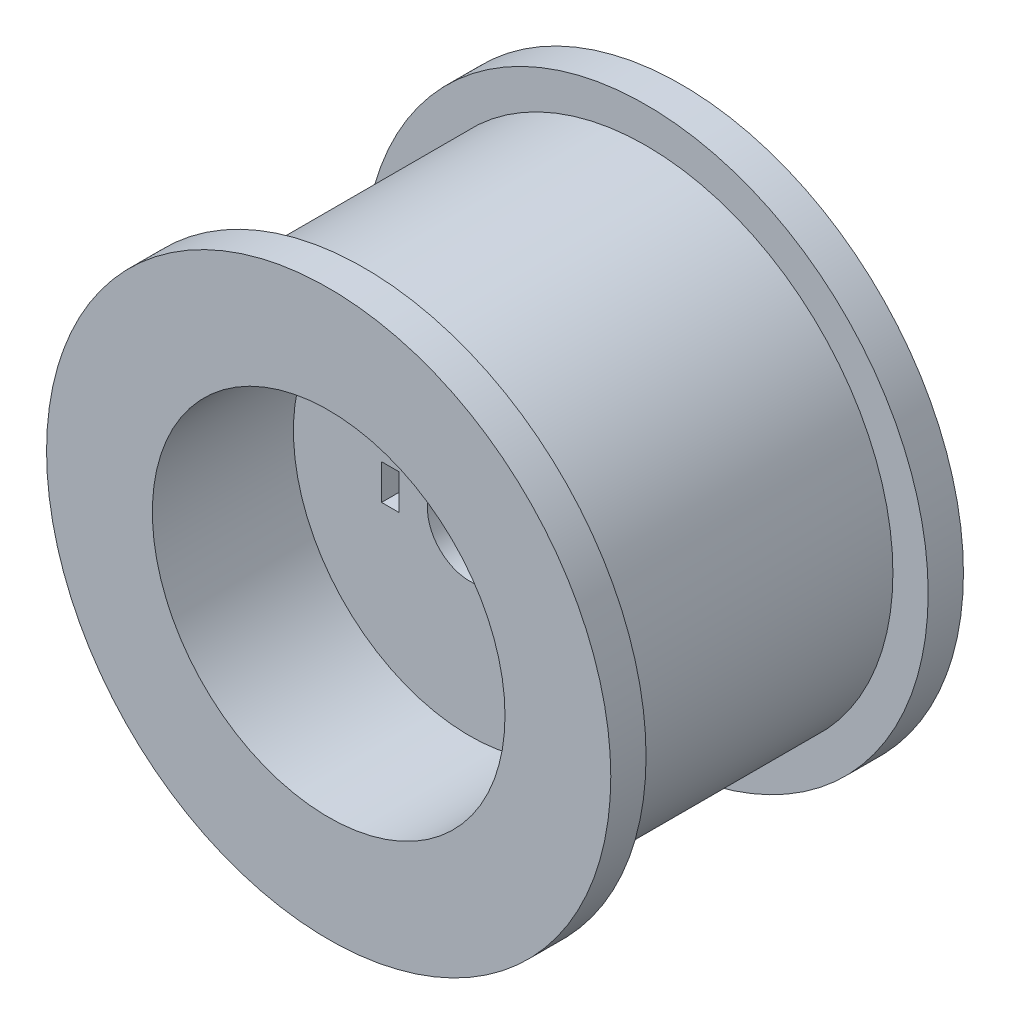
ISO-10303-21;
HEADER;
FILE_DESCRIPTION(('STEP AP214'),'2;1');
FILE_NAME('part.step','',(''),(''),'','','');
FILE_SCHEMA(('AUTOMOTIVE_DESIGN { 1 0 10303 214 1 1 1 1 }'));
ENDSEC;
DATA;
#1=APPLICATION_CONTEXT('core data for automotive mechanical design processes');
#2=APPLICATION_PROTOCOL_DEFINITION('international standard','automotive_design',2000,#1);
#3=PRODUCT_CONTEXT('',#1,'mechanical');
#4=PRODUCT('Part','Part','',(#3));
#5=PRODUCT_RELATED_PRODUCT_CATEGORY('part','',(#4));
#6=PRODUCT_DEFINITION_FORMATION('','',#4);
#7=PRODUCT_DEFINITION_CONTEXT('part definition',#1,'design');
#8=PRODUCT_DEFINITION('design','',#6,#7);
#9=PRODUCT_DEFINITION_SHAPE('','',#8);
#10=(LENGTH_UNIT() NAMED_UNIT(*) SI_UNIT(.MILLI.,.METRE.));
#11=(NAMED_UNIT(*) PLANE_ANGLE_UNIT() SI_UNIT($,.RADIAN.));
#12=(NAMED_UNIT(*) SI_UNIT($,.STERADIAN.) SOLID_ANGLE_UNIT());
#13=UNCERTAINTY_MEASURE_WITH_UNIT(LENGTH_MEASURE(1.E-05),#10,'distance_accuracy_value','');
#14=(GEOMETRIC_REPRESENTATION_CONTEXT(3) GLOBAL_UNCERTAINTY_ASSIGNED_CONTEXT((#13)) GLOBAL_UNIT_ASSIGNED_CONTEXT((#10,
#11,#12)) REPRESENTATION_CONTEXT('',''));
#15=CARTESIAN_POINT('',(0.,0.,0.));
#16=DIRECTION('',(0.,0.,1.));
#17=DIRECTION('',(1.,0.,0.));
#18=AXIS2_PLACEMENT_3D('',#15,#16,#17);
#19=CARTESIAN_POINT('',(0.,0.,40.));
#20=DIRECTION('',(0.,0.,-1.));
#21=DIRECTION('',(-1.,0.,0.));
#22=AXIS2_PLACEMENT_3D('',#19,#20,#21);
#23=CYLINDRICAL_SURFACE('',#22,35.);
#24=CARTESIAN_POINT('',(0.,0.,40.));
#25=DIRECTION('',(0.,0.,1.));
#26=DIRECTION('',(1.,0.,0.));
#27=AXIS2_PLACEMENT_3D('',#24,#25,#26);
#28=CIRCLE('',#27,35.);
#29=CARTESIAN_POINT('',(35.,0.,40.));
#30=VERTEX_POINT('',#29);
#31=EDGE_CURVE('E11',#30,#30,#28,.T.);
#32=ORIENTED_EDGE('',*,*,#31,.F.);
#33=EDGE_LOOP('',(#32));
#34=FACE_BOUND('',#33,.T.);
#35=CARTESIAN_POINT('',(0.,0.,0.));
#36=DIRECTION('',(0.,0.,1.));
#37=DIRECTION('',(1.,0.,0.));
#38=AXIS2_PLACEMENT_3D('',#35,#36,#37);
#39=CIRCLE('',#38,35.);
#40=CARTESIAN_POINT('',(35.,0.,0.));
#41=VERTEX_POINT('',#40);
#42=EDGE_CURVE('E129',#41,#41,#39,.T.);
#43=ORIENTED_EDGE('',*,*,#42,.T.);
#44=EDGE_LOOP('',(#43));
#45=FACE_BOUND('',#44,.T.);
#46=ADVANCED_FACE('F32',(#34,#45),#23,.T.);
#47=CARTESIAN_POINT('',(0.,0.,45.));
#48=DIRECTION('',(0.,0.,-1.));
#49=DIRECTION('',(-1.,0.,0.));
#50=AXIS2_PLACEMENT_3D('',#47,#48,#49);
#51=CYLINDRICAL_SURFACE('',#50,40.);
#52=CARTESIAN_POINT('',(0.,0.,45.));
#53=DIRECTION('',(0.,0.,1.));
#54=DIRECTION('',(1.,0.,0.));
#55=AXIS2_PLACEMENT_3D('',#52,#53,#54);
#56=CIRCLE('',#55,40.);
#57=CARTESIAN_POINT('',(40.,0.,45.));
#58=VERTEX_POINT('',#57);
#59=EDGE_CURVE('E40',#58,#58,#56,.T.);
#60=ORIENTED_EDGE('',*,*,#59,.F.);
#61=EDGE_LOOP('',(#60));
#62=FACE_BOUND('',#61,.T.);
#63=CARTESIAN_POINT('',(0.,0.,40.));
#64=DIRECTION('',(0.,0.,1.));
#65=DIRECTION('',(1.,0.,0.));
#66=AXIS2_PLACEMENT_3D('',#63,#64,#65);
#67=CIRCLE('',#66,40.);
#68=CARTESIAN_POINT('',(40.,0.,40.));
#69=VERTEX_POINT('',#68);
#70=EDGE_CURVE('E134',#69,#69,#67,.T.);
#71=ORIENTED_EDGE('',*,*,#70,.T.);
#72=EDGE_LOOP('',(#71));
#73=FACE_BOUND('',#72,.T.);
#74=ADVANCED_FACE('F165',(#62,#73),#51,.T.);
#75=CARTESIAN_POINT('',(0.,0.,45.));
#76=DIRECTION('',(0.,0.,1.));
#77=DIRECTION('',(1.,0.,0.));
#78=AXIS2_PLACEMENT_3D('',#75,#76,#77);
#79=PLANE('',#78);
#80=CARTESIAN_POINT('',(0.,0.,45.));
#81=DIRECTION('',(0.,0.,1.));
#82=DIRECTION('',(1.,0.,0.));
#83=AXIS2_PLACEMENT_3D('',#80,#81,#82);
#84=CIRCLE('',#83,25.);
#85=CARTESIAN_POINT('',(25.,0.,45.));
#86=VERTEX_POINT('',#85);
#87=EDGE_CURVE('E116',#86,#86,#84,.T.);
#88=ORIENTED_EDGE('',*,*,#87,.F.);
#89=EDGE_LOOP('',(#88));
#90=FACE_BOUND('',#89,.T.);
#91=ORIENTED_EDGE('',*,*,#59,.T.);
#92=EDGE_LOOP('',(#91));
#93=FACE_BOUND('',#92,.T.);
#94=ADVANCED_FACE('F159',(#90,#93),#79,.T.);
#95=CARTESIAN_POINT('',(0.,0.,40.));
#96=DIRECTION('',(0.,0.,1.));
#97=DIRECTION('',(1.,0.,0.));
#98=AXIS2_PLACEMENT_3D('',#95,#96,#97);
#99=PLANE('',#98);
#100=ORIENTED_EDGE('',*,*,#31,.T.);
#101=EDGE_LOOP('',(#100));
#102=FACE_BOUND('',#101,.T.);
#103=ORIENTED_EDGE('',*,*,#70,.F.);
#104=EDGE_LOOP('',(#103));
#105=FACE_BOUND('',#104,.T.);
#106=ADVANCED_FACE('F150',(#102,#105),#99,.F.);
#107=CARTESIAN_POINT('',(0.,0.,-5.));
#108=DIRECTION('',(0.,0.,1.));
#109=DIRECTION('',(1.,0.,0.));
#110=AXIS2_PLACEMENT_3D('',#107,#108,#109);
#111=CYLINDRICAL_SURFACE('',#110,40.);
#112=CARTESIAN_POINT('',(0.,0.,-5.));
#113=DIRECTION('',(0.,0.,-1.));
#114=DIRECTION('',(-1.,0.,0.));
#115=AXIS2_PLACEMENT_3D('',#112,#113,#114);
#116=CIRCLE('',#115,40.);
#117=CARTESIAN_POINT('',(-40.,0.,-5.));
#118=VERTEX_POINT('',#117);
#119=EDGE_CURVE('E126',#118,#118,#116,.T.);
#120=ORIENTED_EDGE('',*,*,#119,.F.);
#121=EDGE_LOOP('',(#120));
#122=FACE_BOUND('',#121,.T.);
#123=CARTESIAN_POINT('',(0.,0.,0.));
#124=DIRECTION('',(0.,0.,-1.));
#125=DIRECTION('',(-1.,0.,0.));
#126=AXIS2_PLACEMENT_3D('',#123,#124,#125);
#127=CIRCLE('',#126,40.);
#128=CARTESIAN_POINT('',(-40.,0.,0.));
#129=VERTEX_POINT('',#128);
#130=EDGE_CURVE('E123',#129,#129,#127,.T.);
#131=ORIENTED_EDGE('',*,*,#130,.T.);
#132=EDGE_LOOP('',(#131));
#133=FACE_BOUND('',#132,.T.);
#134=ADVANCED_FACE('F148',(#122,#133),#111,.T.);
#135=CARTESIAN_POINT('',(0.,0.,-5.));
#136=DIRECTION('',(0.,0.,-1.));
#137=DIRECTION('',(-1.,0.,0.));
#138=AXIS2_PLACEMENT_3D('',#135,#136,#137);
#139=PLANE('',#138);
#140=CARTESIAN_POINT('',(0.,0.,-5.));
#141=DIRECTION('',(0.,0.,-1.));
#142=DIRECTION('',(-1.,0.,0.));
#143=AXIS2_PLACEMENT_3D('',#140,#141,#142);
#144=CIRCLE('',#143,25.);
#145=CARTESIAN_POINT('',(-25.,0.,-5.));
#146=VERTEX_POINT('',#145);
#147=EDGE_CURVE('E117',#146,#146,#144,.T.);
#148=ORIENTED_EDGE('',*,*,#147,.F.);
#149=EDGE_LOOP('',(#148));
#150=FACE_BOUND('',#149,.T.);
#151=ORIENTED_EDGE('',*,*,#119,.T.);
#152=EDGE_LOOP('',(#151));
#153=FACE_BOUND('',#152,.T.);
#154=ADVANCED_FACE('F144',(#150,#153),#139,.T.);
#155=CARTESIAN_POINT('',(0.,0.,0.));
#156=DIRECTION('',(0.,0.,-1.));
#157=DIRECTION('',(-1.,0.,0.));
#158=AXIS2_PLACEMENT_3D('',#155,#156,#157);
#159=PLANE('',#158);
#160=ORIENTED_EDGE('',*,*,#42,.F.);
#161=EDGE_LOOP('',(#160));
#162=FACE_BOUND('',#161,.T.);
#163=ORIENTED_EDGE('',*,*,#130,.F.);
#164=EDGE_LOOP('',(#163));
#165=FACE_BOUND('',#164,.T.);
#166=ADVANCED_FACE('F140',(#162,#165),#159,.F.);
#167=CARTESIAN_POINT('',(0.,0.,25.));
#168=DIRECTION('',(0.,0.,1.));
#169=DIRECTION('',(1.,0.,0.));
#170=AXIS2_PLACEMENT_3D('',#167,#168,#169);
#171=CYLINDRICAL_SURFACE('',#170,25.);
#172=CARTESIAN_POINT('',(0.,0.,25.));
#173=DIRECTION('',(0.,0.,1.));
#174=DIRECTION('',(1.,0.,0.));
#175=AXIS2_PLACEMENT_3D('',#172,#173,#174);
#176=CIRCLE('',#175,25.);
#177=CARTESIAN_POINT('',(25.,0.,25.));
#178=VERTEX_POINT('',#177);
#179=EDGE_CURVE('E120',#178,#178,#176,.T.);
#180=ORIENTED_EDGE('',*,*,#179,.F.);
#181=EDGE_LOOP('',(#180));
#182=FACE_BOUND('',#181,.T.);
#183=ORIENTED_EDGE('',*,*,#87,.T.);
#184=EDGE_LOOP('',(#183));
#185=FACE_BOUND('',#184,.T.);
#186=ADVANCED_FACE('F143',(#182,#185),#171,.F.);
#187=CARTESIAN_POINT('',(0.,0.,25.));
#188=DIRECTION('',(0.,0.,1.));
#189=DIRECTION('',(1.,0.,0.));
#190=AXIS2_PLACEMENT_3D('',#187,#188,#189);
#191=PLANE('',#190);
#192=DIRECTION('',(0.,1.,0.));
#193=VECTOR('',#192,1.);
#194=CARTESIAN_POINT('',(-10.,-0.0730995796232149,25.));
#195=LINE('',#194,#193);
#196=CARTESIAN_POINT('',(-10.,-2.57309957962322,25.));
#197=VERTEX_POINT('',#196);
#198=CARTESIAN_POINT('',(-10.,2.42690042037679,25.));
#199=VERTEX_POINT('',#198);
#200=EDGE_CURVE('E78',#197,#199,#195,.T.);
#201=ORIENTED_EDGE('',*,*,#200,.F.);
#202=DIRECTION('',(1.,0.,0.));
#203=VECTOR('',#202,1.);
#204=CARTESIAN_POINT('',(-10.,-2.57309957962322,25.));
#205=LINE('',#204,#203);
#206=CARTESIAN_POINT('',(-12.5,-2.57309957962322,25.));
#207=VERTEX_POINT('',#206);
#208=EDGE_CURVE('E93',#207,#197,#205,.T.);
#209=ORIENTED_EDGE('',*,*,#208,.F.);
#210=DIRECTION('',(0.,-1.,0.));
#211=VECTOR('',#210,1.);
#212=CARTESIAN_POINT('',(-12.5,-0.0730995796232143,25.));
#213=LINE('',#212,#211);
#214=CARTESIAN_POINT('',(-12.5,2.42690042037679,25.));
#215=VERTEX_POINT('',#214);
#216=EDGE_CURVE('E100',#215,#207,#213,.T.);
#217=ORIENTED_EDGE('',*,*,#216,.F.);
#218=DIRECTION('',(-1.,0.,0.));
#219=VECTOR('',#218,1.);
#220=CARTESIAN_POINT('',(-10.,2.42690042037679,25.));
#221=LINE('',#220,#219);
#222=EDGE_CURVE('E98',#199,#215,#221,.T.);
#223=ORIENTED_EDGE('',*,*,#222,.F.);
#224=EDGE_LOOP('',(#201,#209,#217,#223));
#225=FACE_BOUND('',#224,.T.);
#226=CARTESIAN_POINT('',(0.,0.,25.));
#227=DIRECTION('',(0.,0.,1.));
#228=DIRECTION('',(1.,0.,0.));
#229=AXIS2_PLACEMENT_3D('',#226,#227,#228);
#230=CIRCLE('',#229,6.);
#231=CARTESIAN_POINT('',(6.,0.,25.));
#232=VERTEX_POINT('',#231);
#233=EDGE_CURVE('E107',#232,#232,#230,.T.);
#234=ORIENTED_EDGE('',*,*,#233,.F.);
#235=EDGE_LOOP('',(#234));
#236=FACE_BOUND('',#235,.T.);
#237=ORIENTED_EDGE('',*,*,#179,.T.);
#238=EDGE_LOOP('',(#237));
#239=FACE_BOUND('',#238,.T.);
#240=ADVANCED_FACE('F186',(#225,#236,#239),#191,.T.);
#241=CARTESIAN_POINT('',(0.,0.,15.));
#242=DIRECTION('',(0.,0.,-1.));
#243=DIRECTION('',(-1.,0.,0.));
#244=AXIS2_PLACEMENT_3D('',#241,#242,#243);
#245=CYLINDRICAL_SURFACE('',#244,25.);
#246=CARTESIAN_POINT('',(0.,0.,15.));
#247=DIRECTION('',(0.,0.,-1.));
#248=DIRECTION('',(-1.,0.,0.));
#249=AXIS2_PLACEMENT_3D('',#246,#247,#248);
#250=CIRCLE('',#249,25.);
#251=CARTESIAN_POINT('',(-25.,0.,15.));
#252=VERTEX_POINT('',#251);
#253=EDGE_CURVE('E113',#252,#252,#250,.T.);
#254=ORIENTED_EDGE('',*,*,#253,.F.);
#255=EDGE_LOOP('',(#254));
#256=FACE_BOUND('',#255,.T.);
#257=ORIENTED_EDGE('',*,*,#147,.T.);
#258=EDGE_LOOP('',(#257));
#259=FACE_BOUND('',#258,.T.);
#260=ADVANCED_FACE('F192',(#256,#259),#245,.F.);
#261=CARTESIAN_POINT('',(0.,0.,15.));
#262=DIRECTION('',(0.,0.,-1.));
#263=DIRECTION('',(-1.,0.,0.));
#264=AXIS2_PLACEMENT_3D('',#261,#262,#263);
#265=PLANE('',#264);
#266=DIRECTION('',(0.,1.,0.));
#267=VECTOR('',#266,1.);
#268=CARTESIAN_POINT('',(-10.,-0.0730995796232149,15.));
#269=LINE('',#268,#267);
#270=CARTESIAN_POINT('',(-10.,-2.57309957962322,15.));
#271=VERTEX_POINT('',#270);
#272=CARTESIAN_POINT('',(-10.,2.42690042037679,15.));
#273=VERTEX_POINT('',#272);
#274=EDGE_CURVE('E75',#271,#273,#269,.T.);
#275=ORIENTED_EDGE('',*,*,#274,.T.);
#276=DIRECTION('',(-1.,0.,0.));
#277=VECTOR('',#276,1.);
#278=CARTESIAN_POINT('',(-10.,2.42690042037679,15.));
#279=LINE('',#278,#277);
#280=CARTESIAN_POINT('',(-12.5,2.42690042037679,15.));
#281=VERTEX_POINT('',#280);
#282=EDGE_CURVE('E84',#273,#281,#279,.T.);
#283=ORIENTED_EDGE('',*,*,#282,.T.);
#284=DIRECTION('',(0.,-1.,0.));
#285=VECTOR('',#284,1.);
#286=CARTESIAN_POINT('',(-12.5,-0.0730995796232143,15.));
#287=LINE('',#286,#285);
#288=CARTESIAN_POINT('',(-12.5,-2.57309957962322,15.));
#289=VERTEX_POINT('',#288);
#290=EDGE_CURVE('E56',#281,#289,#287,.T.);
#291=ORIENTED_EDGE('',*,*,#290,.T.);
#292=DIRECTION('',(1.,0.,0.));
#293=VECTOR('',#292,1.);
#294=CARTESIAN_POINT('',(-10.,-2.57309957962322,15.));
#295=LINE('',#294,#293);
#296=EDGE_CURVE('E81',#289,#271,#295,.T.);
#297=ORIENTED_EDGE('',*,*,#296,.T.);
#298=EDGE_LOOP('',(#275,#283,#291,#297));
#299=FACE_BOUND('',#298,.T.);
#300=CARTESIAN_POINT('',(0.,0.,15.));
#301=DIRECTION('',(0.,0.,-1.));
#302=DIRECTION('',(-1.,0.,0.));
#303=AXIS2_PLACEMENT_3D('',#300,#301,#302);
#304=CIRCLE('',#303,6.);
#305=CARTESIAN_POINT('',(-6.,0.,15.));
#306=VERTEX_POINT('',#305);
#307=EDGE_CURVE('E35',#306,#306,#304,.T.);
#308=ORIENTED_EDGE('',*,*,#307,.F.);
#309=EDGE_LOOP('',(#308));
#310=FACE_BOUND('',#309,.T.);
#311=ORIENTED_EDGE('',*,*,#253,.T.);
#312=EDGE_LOOP('',(#311));
#313=FACE_BOUND('',#312,.T.);
#314=ADVANCED_FACE('F89',(#299,#310,#313),#265,.T.);
#315=CARTESIAN_POINT('',(0.,0.,5.));
#316=DIRECTION('',(0.,0.,1.));
#317=DIRECTION('',(1.,0.,0.));
#318=AXIS2_PLACEMENT_3D('',#315,#316,#317);
#319=CYLINDRICAL_SURFACE('',#318,6.);
#320=ORIENTED_EDGE('',*,*,#307,.T.);
#321=EDGE_LOOP('',(#320));
#322=FACE_BOUND('',#321,.T.);
#323=ORIENTED_EDGE('',*,*,#233,.T.);
#324=EDGE_LOOP('',(#323));
#325=FACE_BOUND('',#324,.T.);
#326=ADVANCED_FACE('F202',(#322,#325),#319,.F.);
#327=CARTESIAN_POINT('',(-10.,-0.0730995796232149,15.));
#328=DIRECTION('',(1.,0.,0.));
#329=DIRECTION('',(0.,0.,-1.));
#330=AXIS2_PLACEMENT_3D('',#327,#328,#329);
#331=PLANE('',#330);
#332=ORIENTED_EDGE('',*,*,#200,.T.);
#333=DIRECTION('',(0.,0.,1.));
#334=VECTOR('',#333,1.);
#335=CARTESIAN_POINT('',(-10.,2.42690042037679,15.));
#336=LINE('',#335,#334);
#337=EDGE_CURVE('E48',#273,#199,#336,.T.);
#338=ORIENTED_EDGE('',*,*,#337,.F.);
#339=ORIENTED_EDGE('',*,*,#274,.F.);
#340=DIRECTION('',(0.,0.,1.));
#341=VECTOR('',#340,1.);
#342=CARTESIAN_POINT('',(-10.,-2.57309957962322,15.));
#343=LINE('',#342,#341);
#344=EDGE_CURVE('E105',#271,#197,#343,.T.);
#345=ORIENTED_EDGE('',*,*,#344,.T.);
#346=EDGE_LOOP('',(#332,#338,#339,#345));
#347=FACE_BOUND('',#346,.T.);
#348=ADVANCED_FACE('F73',(#347),#331,.F.);
#349=CARTESIAN_POINT('',(-10.,-2.57309957962322,15.));
#350=DIRECTION('',(0.,-1.,0.));
#351=DIRECTION('',(1.,0.,0.));
#352=AXIS2_PLACEMENT_3D('',#349,#350,#351);
#353=PLANE('',#352);
#354=ORIENTED_EDGE('',*,*,#208,.T.);
#355=ORIENTED_EDGE('',*,*,#344,.F.);
#356=ORIENTED_EDGE('',*,*,#296,.F.);
#357=DIRECTION('',(0.,0.,1.));
#358=VECTOR('',#357,1.);
#359=CARTESIAN_POINT('',(-12.5,-2.57309957962322,15.));
#360=LINE('',#359,#358);
#361=EDGE_CURVE('E108',#289,#207,#360,.T.);
#362=ORIENTED_EDGE('',*,*,#361,.T.);
#363=EDGE_LOOP('',(#354,#355,#356,#362));
#364=FACE_BOUND('',#363,.T.);
#365=ADVANCED_FACE('F211',(#364),#353,.F.);
#366=CARTESIAN_POINT('',(-12.5,-0.0730995796232143,15.));
#367=DIRECTION('',(-1.,0.,0.));
#368=DIRECTION('',(0.,0.,1.));
#369=AXIS2_PLACEMENT_3D('',#366,#367,#368);
#370=PLANE('',#369);
#371=ORIENTED_EDGE('',*,*,#216,.T.);
#372=ORIENTED_EDGE('',*,*,#361,.F.);
#373=ORIENTED_EDGE('',*,*,#290,.F.);
#374=DIRECTION('',(0.,0.,1.));
#375=VECTOR('',#374,1.);
#376=CARTESIAN_POINT('',(-12.5,2.42690042037679,15.));
#377=LINE('',#376,#375);
#378=EDGE_CURVE('E80',#281,#215,#377,.T.);
#379=ORIENTED_EDGE('',*,*,#378,.T.);
#380=EDGE_LOOP('',(#371,#372,#373,#379));
#381=FACE_BOUND('',#380,.T.);
#382=ADVANCED_FACE('F208',(#381),#370,.F.);
#383=CARTESIAN_POINT('',(-10.,2.42690042037679,15.));
#384=DIRECTION('',(0.,1.,0.));
#385=DIRECTION('',(0.,0.,1.));
#386=AXIS2_PLACEMENT_3D('',#383,#384,#385);
#387=PLANE('',#386);
#388=ORIENTED_EDGE('',*,*,#222,.T.);
#389=ORIENTED_EDGE('',*,*,#378,.F.);
#390=ORIENTED_EDGE('',*,*,#282,.F.);
#391=ORIENTED_EDGE('',*,*,#337,.T.);
#392=EDGE_LOOP('',(#388,#389,#390,#391));
#393=FACE_BOUND('',#392,.T.);
#394=ADVANCED_FACE('F85',(#393),#387,.F.);
#395=CLOSED_SHELL('',(#46,#74,#94,#106,#134,#154,#166,#186,#240,#260,#314,#326,#348,#365,#382,#394));
#396=MANIFOLD_SOLID_BREP('B2',#395);
#397=ADVANCED_BREP_SHAPE_REPRESENTATION('',(#18,#396),#14);
#398=SHAPE_DEFINITION_REPRESENTATION(#9,#397);
ENDSEC;
END-ISO-10303-21;
